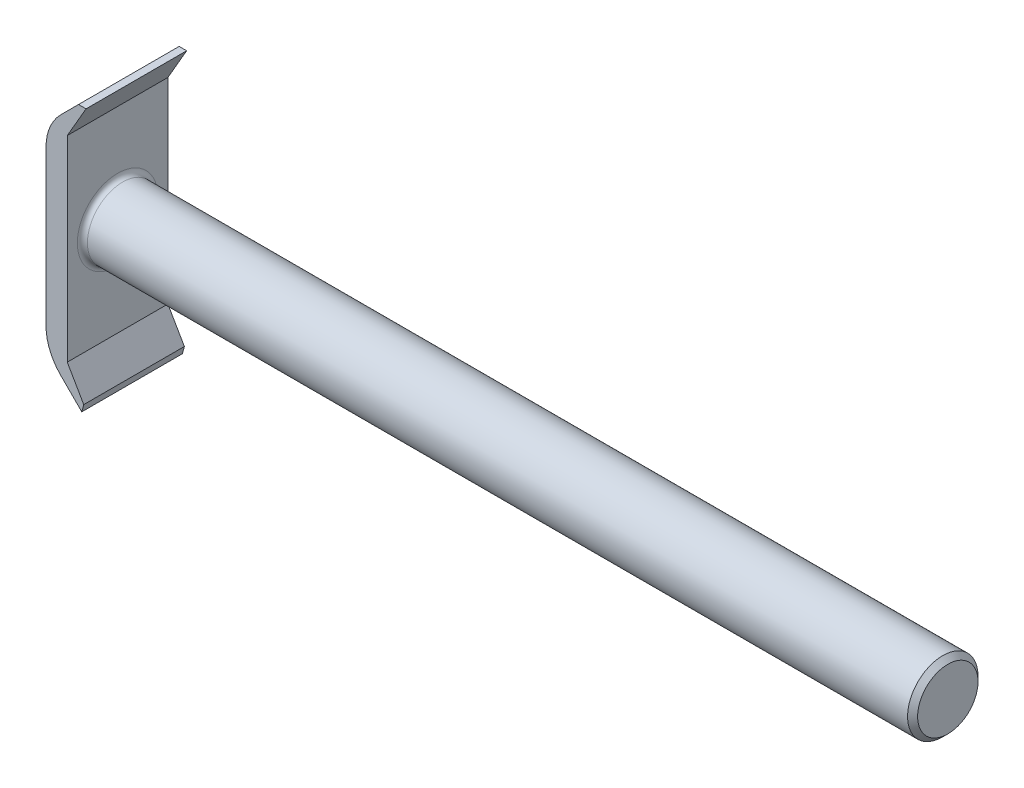
ISO-10303-21;
HEADER;
FILE_DESCRIPTION(('STEP AP214'),'2;1');
FILE_NAME('part.step','',(''),(''),'','','');
FILE_SCHEMA(('AUTOMOTIVE_DESIGN { 1 0 10303 214 1 1 1 1 }'));
ENDSEC;
DATA;
#1=APPLICATION_CONTEXT('core data for automotive mechanical design processes');
#2=APPLICATION_PROTOCOL_DEFINITION('international standard','automotive_design',2000,#1);
#3=PRODUCT_CONTEXT('',#1,'mechanical');
#4=PRODUCT('Part','Part','',(#3));
#5=PRODUCT_RELATED_PRODUCT_CATEGORY('part','',(#4));
#6=PRODUCT_DEFINITION_FORMATION('','',#4);
#7=PRODUCT_DEFINITION_CONTEXT('part definition',#1,'design');
#8=PRODUCT_DEFINITION('design','',#6,#7);
#9=PRODUCT_DEFINITION_SHAPE('','',#8);
#10=(LENGTH_UNIT() NAMED_UNIT(*) SI_UNIT(.MILLI.,.METRE.));
#11=(NAMED_UNIT(*) PLANE_ANGLE_UNIT() SI_UNIT($,.RADIAN.));
#12=(NAMED_UNIT(*) SI_UNIT($,.STERADIAN.) SOLID_ANGLE_UNIT());
#13=UNCERTAINTY_MEASURE_WITH_UNIT(LENGTH_MEASURE(1.E-05),#10,'distance_accuracy_value','');
#14=(GEOMETRIC_REPRESENTATION_CONTEXT(3) GLOBAL_UNCERTAINTY_ASSIGNED_CONTEXT((#13)) GLOBAL_UNIT_ASSIGNED_CONTEXT((#10,
#11,#12)) REPRESENTATION_CONTEXT('',''));
#15=CARTESIAN_POINT('',(0.,0.,0.));
#16=DIRECTION('',(0.,0.,1.));
#17=DIRECTION('',(1.,0.,0.));
#18=AXIS2_PLACEMENT_3D('',#15,#16,#17);
#19=CARTESIAN_POINT('',(165.,0.,0.));
#20=DIRECTION('',(-1.,0.,0.));
#21=DIRECTION('',(0.,0.,1.));
#22=AXIS2_PLACEMENT_3D('',#19,#20,#21);
#23=CYLINDRICAL_SURFACE('',#22,7.);
#24=CARTESIAN_POINT('',(1.,0.,0.));
#25=DIRECTION('',(1.,0.,0.));
#26=DIRECTION('',(0.,0.,-1.));
#27=AXIS2_PLACEMENT_3D('',#24,#25,#26);
#28=CIRCLE('',#27,7.);
#29=CARTESIAN_POINT('',(1.,0.,-7.));
#30=VERTEX_POINT('',#29);
#31=EDGE_CURVE('E45',#30,#30,#28,.T.);
#32=ORIENTED_EDGE('',*,*,#31,.T.);
#33=EDGE_LOOP('',(#32));
#34=FACE_BOUND('',#33,.T.);
#35=CARTESIAN_POINT('',(164.,0.,0.));
#36=DIRECTION('',(1.,0.,0.));
#37=DIRECTION('',(0.,0.,-1.));
#38=AXIS2_PLACEMENT_3D('',#35,#36,#37);
#39=CIRCLE('',#38,7.);
#40=CARTESIAN_POINT('',(164.,0.,-7.));
#41=VERTEX_POINT('',#40);
#42=EDGE_CURVE('E186',#41,#41,#39,.F.);
#43=ORIENTED_EDGE('',*,*,#42,.T.);
#44=EDGE_LOOP('',(#43));
#45=FACE_BOUND('',#44,.T.);
#46=ADVANCED_FACE('F37',(#34,#45),#23,.T.);
#47=CARTESIAN_POINT('',(165.,0.,0.));
#48=DIRECTION('',(1.,0.,0.));
#49=DIRECTION('',(0.,0.,-1.));
#50=AXIS2_PLACEMENT_3D('',#47,#48,#49);
#51=PLANE('',#50);
#52=CARTESIAN_POINT('',(165.,0.,0.));
#53=DIRECTION('',(1.,0.,0.));
#54=DIRECTION('',(0.,0.,-1.));
#55=AXIS2_PLACEMENT_3D('',#52,#53,#54);
#56=CIRCLE('',#55,6.00000000000003);
#57=CARTESIAN_POINT('',(165.,0.,-6.00000000000003));
#58=VERTEX_POINT('',#57);
#59=EDGE_CURVE('E183',#58,#58,#56,.T.);
#60=ORIENTED_EDGE('',*,*,#59,.T.);
#61=EDGE_LOOP('',(#60));
#62=FACE_BOUND('',#61,.T.);
#63=ADVANCED_FACE('F219',(#62),#51,.T.);
#64=CARTESIAN_POINT('',(5.77350269189627,-29.5,-10.));
#65=DIRECTION('',(0.866025403784438,0.500000000000001,0.));
#66=DIRECTION('',(-0.500000000000001,0.866025403784438,0.));
#67=AXIS2_PLACEMENT_3D('',#64,#65,#66);
#68=PLANE('',#67);
#69=DIRECTION('',(-0.500000000000001,0.866025403784438,0.));
#70=VECTOR('',#69,1.);
#71=CARTESIAN_POINT('',(5.77350269189627,-29.5,10.));
#72=LINE('',#71,#70);
#73=CARTESIAN_POINT('',(3.27350269189632,-25.1698729810779,10.));
#74=VERTEX_POINT('',#73);
#75=CARTESIAN_POINT('',(0.,-19.5,10.));
#76=VERTEX_POINT('',#75);
#77=EDGE_CURVE('E137',#74,#76,#72,.T.);
#78=ORIENTED_EDGE('',*,*,#77,.F.);
#79=DIRECTION('',(0.,0.,-1.));
#80=VECTOR('',#79,1.);
#81=CARTESIAN_POINT('',(3.27350269189632,-25.1698729810779,-10.));
#82=LINE('',#81,#80);
#83=CARTESIAN_POINT('',(3.27350269189632,-25.1698729810779,-10.));
#84=VERTEX_POINT('',#83);
#85=EDGE_CURVE('E173',#74,#84,#82,.T.);
#86=ORIENTED_EDGE('',*,*,#85,.T.);
#87=DIRECTION('',(-0.500000000000001,0.866025403784438,0.));
#88=VECTOR('',#87,1.);
#89=CARTESIAN_POINT('',(5.77350269189627,-29.5,-10.));
#90=LINE('',#89,#88);
#91=CARTESIAN_POINT('',(0.,-19.5,-10.));
#92=VERTEX_POINT('',#91);
#93=EDGE_CURVE('E129',#84,#92,#90,.T.);
#94=ORIENTED_EDGE('',*,*,#93,.T.);
#95=DIRECTION('',(0.,0.,1.));
#96=VECTOR('',#95,1.);
#97=CARTESIAN_POINT('',(0.,-19.5,-10.));
#98=LINE('',#97,#96);
#99=EDGE_CURVE('E128',#92,#76,#98,.T.);
#100=ORIENTED_EDGE('',*,*,#99,.T.);
#101=EDGE_LOOP('',(#78,#86,#94,#100));
#102=FACE_BOUND('',#101,.T.);
#103=ADVANCED_FACE('F224',(#102),#68,.T.);
#104=CARTESIAN_POINT('',(-4.22649730810372,-19.5,-10.));
#105=DIRECTION('',(-0.707106781186547,-0.707106781186548,0.));
#106=DIRECTION('',(0.707106781186548,-0.707106781186547,0.));
#107=AXIS2_PLACEMENT_3D('',#104,#105,#106);
#108=PLANE('',#107);
#109=DIRECTION('',(0.707106781186548,-0.707106781186547,0.));
#110=VECTOR('',#109,1.);
#111=CARTESIAN_POINT('',(-4.22649730810372,-19.5,10.));
#112=LINE('',#111,#110);
#113=CARTESIAN_POINT('',(-1.2975651199692,-22.4289321881345,10.));
#114=VERTEX_POINT('',#113);
#115=CARTESIAN_POINT('',(2.88675134594822,-26.6132486540519,10.));
#116=VERTEX_POINT('',#115);
#117=EDGE_CURVE('E151',#114,#116,#112,.T.);
#118=ORIENTED_EDGE('',*,*,#117,.F.);
#119=DIRECTION('',(0.,0.,1.));
#120=VECTOR('',#119,1.);
#121=CARTESIAN_POINT('',(-1.2975651199692,-22.4289321881345,-10.));
#122=LINE('',#121,#120);
#123=CARTESIAN_POINT('',(-1.2975651199692,-22.4289321881345,-10.));
#124=VERTEX_POINT('',#123);
#125=EDGE_CURVE('E60',#114,#124,#122,.F.);
#126=ORIENTED_EDGE('',*,*,#125,.T.);
#127=DIRECTION('',(0.707106781186548,-0.707106781186547,0.));
#128=VECTOR('',#127,1.);
#129=CARTESIAN_POINT('',(-4.22649730810372,-19.5,-10.));
#130=LINE('',#129,#128);
#131=CARTESIAN_POINT('',(2.88675134594822,-26.6132486540519,-10.));
#132=VERTEX_POINT('',#131);
#133=EDGE_CURVE('E162',#124,#132,#130,.T.);
#134=ORIENTED_EDGE('',*,*,#133,.T.);
#135=DIRECTION('',(0.,0.,1.));
#136=VECTOR('',#135,1.);
#137=CARTESIAN_POINT('',(2.88675134594822,-26.6132486540519,-10.));
#138=LINE('',#137,#136);
#139=EDGE_CURVE('E165',#132,#116,#138,.T.);
#140=ORIENTED_EDGE('',*,*,#139,.T.);
#141=EDGE_LOOP('',(#118,#126,#134,#140));
#142=FACE_BOUND('',#141,.T.);
#143=ADVANCED_FACE('F264',(#142),#108,.T.);
#144=CARTESIAN_POINT('',(-4.22649730810372,19.5,-10.));
#145=DIRECTION('',(-1.,0.,0.));
#146=DIRECTION('',(0.,-1.,0.));
#147=AXIS2_PLACEMENT_3D('',#144,#145,#146);
#148=PLANE('',#147);
#149=DIRECTION('',(0.,-1.,0.));
#150=VECTOR('',#149,1.);
#151=CARTESIAN_POINT('',(-4.22649730810372,19.5,-10.));
#152=LINE('',#151,#150);
#153=CARTESIAN_POINT('',(-4.22649730810372,15.357864376269,-10.));
#154=VERTEX_POINT('',#153);
#155=CARTESIAN_POINT('',(-4.22649730810372,-15.357864376269,-10.));
#156=VERTEX_POINT('',#155);
#157=EDGE_CURVE('E159',#154,#156,#152,.T.);
#158=ORIENTED_EDGE('',*,*,#157,.T.);
#159=DIRECTION('',(0.,0.,1.));
#160=VECTOR('',#159,1.);
#161=CARTESIAN_POINT('',(-4.22649730810372,-15.357864376269,-10.));
#162=LINE('',#161,#160);
#163=CARTESIAN_POINT('',(-4.22649730810372,-15.357864376269,10.));
#164=VERTEX_POINT('',#163);
#165=EDGE_CURVE('E191',#156,#164,#162,.T.);
#166=ORIENTED_EDGE('',*,*,#165,.T.);
#167=DIRECTION('',(0.,-1.,0.));
#168=VECTOR('',#167,1.);
#169=CARTESIAN_POINT('',(-4.22649730810372,19.5,10.));
#170=LINE('',#169,#168);
#171=CARTESIAN_POINT('',(-4.22649730810372,15.357864376269,10.));
#172=VERTEX_POINT('',#171);
#173=EDGE_CURVE('E147',#172,#164,#170,.T.);
#174=ORIENTED_EDGE('',*,*,#173,.F.);
#175=DIRECTION('',(0.,0.,1.));
#176=VECTOR('',#175,1.);
#177=CARTESIAN_POINT('',(-4.22649730810372,15.357864376269,-10.));
#178=LINE('',#177,#176);
#179=EDGE_CURVE('E189',#172,#154,#178,.F.);
#180=ORIENTED_EDGE('',*,*,#179,.T.);
#181=EDGE_LOOP('',(#158,#166,#174,#180));
#182=FACE_BOUND('',#181,.T.);
#183=ADVANCED_FACE('F249',(#182),#148,.T.);
#184=CARTESIAN_POINT('',(5.77350269189627,29.5,-10.));
#185=DIRECTION('',(-0.707106781186548,0.707106781186547,0.));
#186=DIRECTION('',(-0.707106781186547,-0.707106781186548,0.));
#187=AXIS2_PLACEMENT_3D('',#184,#185,#186);
#188=PLANE('',#187);
#189=DIRECTION('',(-0.707106781186547,-0.707106781186548,0.));
#190=VECTOR('',#189,1.);
#191=CARTESIAN_POINT('',(5.77350269189627,29.5,-10.));
#192=LINE('',#191,#190);
#193=CARTESIAN_POINT('',(2.23796878596356,25.9644660940673,-10.));
#194=VERTEX_POINT('',#193);
#195=CARTESIAN_POINT('',(-1.2975651199692,22.4289321881345,-10.));
#196=VERTEX_POINT('',#195);
#197=EDGE_CURVE('E157',#194,#196,#192,.T.);
#198=ORIENTED_EDGE('',*,*,#197,.T.);
#199=DIRECTION('',(0.,0.,1.));
#200=VECTOR('',#199,1.);
#201=CARTESIAN_POINT('',(-1.2975651199692,22.4289321881345,-10.));
#202=LINE('',#201,#200);
#203=CARTESIAN_POINT('',(-1.2975651199692,22.4289321881345,10.));
#204=VERTEX_POINT('',#203);
#205=EDGE_CURVE('E202',#196,#204,#202,.T.);
#206=ORIENTED_EDGE('',*,*,#205,.T.);
#207=DIRECTION('',(-0.707106781186547,-0.707106781186548,0.));
#208=VECTOR('',#207,1.);
#209=CARTESIAN_POINT('',(5.77350269189627,29.5,10.));
#210=LINE('',#209,#208);
#211=CARTESIAN_POINT('',(2.23796878596356,25.9644660940673,10.));
#212=VERTEX_POINT('',#211);
#213=EDGE_CURVE('E144',#212,#204,#210,.T.);
#214=ORIENTED_EDGE('',*,*,#213,.F.);
#215=DIRECTION('',(0.,0.,-1.));
#216=VECTOR('',#215,1.);
#217=CARTESIAN_POINT('',(2.23796878596356,25.9644660940673,-10.));
#218=LINE('',#217,#216);
#219=EDGE_CURVE('E181',#212,#194,#218,.T.);
#220=ORIENTED_EDGE('',*,*,#219,.T.);
#221=EDGE_LOOP('',(#198,#206,#214,#220));
#222=FACE_BOUND('',#221,.T.);
#223=ADVANCED_FACE('F255',(#222),#188,.T.);
#224=CARTESIAN_POINT('',(0.,19.5,-10.));
#225=DIRECTION('',(0.866025403784438,-0.500000000000001,0.));
#226=DIRECTION('',(0.500000000000001,0.866025403784438,0.));
#227=AXIS2_PLACEMENT_3D('',#224,#225,#226);
#228=PLANE('',#227);
#229=DIRECTION('',(0.500000000000001,0.866025403784438,0.));
#230=VECTOR('',#229,1.);
#231=CARTESIAN_POINT('',(0.,19.5,-10.));
#232=LINE('',#231,#230);
#233=CARTESIAN_POINT('',(0.,19.5,-10.));
#234=VERTEX_POINT('',#233);
#235=CARTESIAN_POINT('',(3.73226123957697,25.9644660940673,-10.));
#236=VERTEX_POINT('',#235);
#237=EDGE_CURVE('E155',#234,#236,#232,.T.);
#238=ORIENTED_EDGE('',*,*,#237,.T.);
#239=DIRECTION('',(0.,0.,1.));
#240=VECTOR('',#239,1.);
#241=CARTESIAN_POINT('',(3.73226123957697,25.9644660940673,-10.));
#242=LINE('',#241,#240);
#243=CARTESIAN_POINT('',(3.73226123957697,25.9644660940673,10.));
#244=VERTEX_POINT('',#243);
#245=EDGE_CURVE('E143',#236,#244,#242,.T.);
#246=ORIENTED_EDGE('',*,*,#245,.T.);
#247=DIRECTION('',(0.500000000000001,0.866025403784438,0.));
#248=VECTOR('',#247,1.);
#249=CARTESIAN_POINT('',(0.,19.5,10.));
#250=LINE('',#249,#248);
#251=CARTESIAN_POINT('',(0.,19.5,10.));
#252=VERTEX_POINT('',#251);
#253=EDGE_CURVE('E135',#252,#244,#250,.T.);
#254=ORIENTED_EDGE('',*,*,#253,.F.);
#255=DIRECTION('',(0.,0.,1.));
#256=VECTOR('',#255,1.);
#257=CARTESIAN_POINT('',(0.,19.5,-10.));
#258=LINE('',#257,#256);
#259=EDGE_CURVE('E117',#234,#252,#258,.T.);
#260=ORIENTED_EDGE('',*,*,#259,.F.);
#261=EDGE_LOOP('',(#238,#246,#254,#260));
#262=FACE_BOUND('',#261,.T.);
#263=ADVANCED_FACE('F141',(#262),#228,.T.);
#264=CARTESIAN_POINT('',(0.,0.,-10.));
#265=DIRECTION('',(1.,0.,0.));
#266=DIRECTION('',(0.,0.,-1.));
#267=AXIS2_PLACEMENT_3D('',#264,#265,#266);
#268=PLANE('',#267);
#269=CARTESIAN_POINT('',(0.,0.,0.));
#270=DIRECTION('',(1.,0.,0.));
#271=DIRECTION('',(0.,0.,-1.));
#272=AXIS2_PLACEMENT_3D('',#269,#270,#271);
#273=CIRCLE('',#272,8.);
#274=CARTESIAN_POINT('',(0.,0.,-8.));
#275=VERTEX_POINT('',#274);
#276=EDGE_CURVE('E11',#275,#275,#273,.F.);
#277=ORIENTED_EDGE('',*,*,#276,.T.);
#278=EDGE_LOOP('',(#277));
#279=FACE_BOUND('',#278,.T.);
#280=ORIENTED_EDGE('',*,*,#259,.T.);
#281=DIRECTION('',(0.,1.,0.));
#282=VECTOR('',#281,1.);
#283=CARTESIAN_POINT('',(0.,-19.5,10.));
#284=LINE('',#283,#282);
#285=EDGE_CURVE('E121',#76,#252,#284,.T.);
#286=ORIENTED_EDGE('',*,*,#285,.F.);
#287=ORIENTED_EDGE('',*,*,#99,.F.);
#288=DIRECTION('',(0.,1.,0.));
#289=VECTOR('',#288,1.);
#290=CARTESIAN_POINT('',(0.,-19.5,-10.));
#291=LINE('',#290,#289);
#292=EDGE_CURVE('E123',#92,#234,#291,.T.);
#293=ORIENTED_EDGE('',*,*,#292,.T.);
#294=EDGE_LOOP('',(#280,#286,#287,#293));
#295=FACE_BOUND('',#294,.T.);
#296=ADVANCED_FACE('F119',(#279,#295),#268,.T.);
#297=CARTESIAN_POINT('',(0.,0.,-10.));
#298=DIRECTION('',(0.,0.,1.));
#299=DIRECTION('',(1.,0.,0.));
#300=AXIS2_PLACEMENT_3D('',#297,#298,#299);
#301=PLANE('',#300);
#302=ORIENTED_EDGE('',*,*,#133,.F.);
#303=CARTESIAN_POINT('',(5.77350269189628,-15.357864376269,-10.));
#304=DIRECTION('',(0.,0.,1.));
#305=DIRECTION('',(1.,0.,0.));
#306=AXIS2_PLACEMENT_3D('',#303,#304,#305);
#307=CIRCLE('',#306,10.);
#308=EDGE_CURVE('E200',#124,#156,#307,.F.);
#309=ORIENTED_EDGE('',*,*,#308,.T.);
#310=ORIENTED_EDGE('',*,*,#157,.F.);
#311=CARTESIAN_POINT('',(5.77350269189628,15.357864376269,-10.));
#312=DIRECTION('',(0.,0.,1.));
#313=DIRECTION('',(1.,0.,0.));
#314=AXIS2_PLACEMENT_3D('',#311,#312,#313);
#315=CIRCLE('',#314,10.);
#316=EDGE_CURVE('E52',#154,#196,#315,.F.);
#317=ORIENTED_EDGE('',*,*,#316,.T.);
#318=ORIENTED_EDGE('',*,*,#197,.F.);
#319=DIRECTION('',(-1.,0.,0.));
#320=VECTOR('',#319,1.);
#321=CARTESIAN_POINT('',(3.73226123957697,25.9644660940673,-10.));
#322=LINE('',#321,#320);
#323=EDGE_CURVE('E175',#194,#236,#322,.F.);
#324=ORIENTED_EDGE('',*,*,#323,.T.);
#325=ORIENTED_EDGE('',*,*,#237,.F.);
#326=ORIENTED_EDGE('',*,*,#292,.F.);
#327=ORIENTED_EDGE('',*,*,#93,.F.);
#328=DIRECTION('',(0.258819045102512,0.965925826289071,0.));
#329=VECTOR('',#328,1.);
#330=CARTESIAN_POINT('',(2.88675134594822,-26.6132486540519,-10.));
#331=LINE('',#330,#329);
#332=EDGE_CURVE('E177',#84,#132,#331,.F.);
#333=ORIENTED_EDGE('',*,*,#332,.T.);
#334=EDGE_LOOP('',(#302,#309,#310,#317,#318,#324,#325,#326,#327,#333));
#335=FACE_BOUND('',#334,.T.);
#336=ADVANCED_FACE('F247',(#335),#301,.F.);
#337=CARTESIAN_POINT('',(0.,0.,10.));
#338=DIRECTION('',(0.,0.,1.));
#339=DIRECTION('',(1.,0.,0.));
#340=AXIS2_PLACEMENT_3D('',#337,#338,#339);
#341=PLANE('',#340);
#342=ORIENTED_EDGE('',*,*,#173,.T.);
#343=CARTESIAN_POINT('',(5.77350269189628,-15.357864376269,10.));
#344=DIRECTION('',(0.,0.,1.));
#345=DIRECTION('',(1.,0.,0.));
#346=AXIS2_PLACEMENT_3D('',#343,#344,#345);
#347=CIRCLE('',#346,10.);
#348=EDGE_CURVE('E196',#164,#114,#347,.T.);
#349=ORIENTED_EDGE('',*,*,#348,.T.);
#350=ORIENTED_EDGE('',*,*,#117,.T.);
#351=DIRECTION('',(-0.258819045102512,-0.965925826289071,0.));
#352=VECTOR('',#351,1.);
#353=CARTESIAN_POINT('',(9.34668783648692,-2.50443745769237,10.));
#354=LINE('',#353,#352);
#355=EDGE_CURVE('E171',#116,#74,#354,.F.);
#356=ORIENTED_EDGE('',*,*,#355,.T.);
#357=ORIENTED_EDGE('',*,*,#77,.T.);
#358=ORIENTED_EDGE('',*,*,#285,.T.);
#359=ORIENTED_EDGE('',*,*,#253,.T.);
#360=DIRECTION('',(1.,0.,0.));
#361=VECTOR('',#360,1.);
#362=CARTESIAN_POINT('',(-1.20568550729588E-13,25.9644660940673,10.));
#363=LINE('',#362,#361);
#364=EDGE_CURVE('E169',#244,#212,#363,.F.);
#365=ORIENTED_EDGE('',*,*,#364,.T.);
#366=ORIENTED_EDGE('',*,*,#213,.T.);
#367=CARTESIAN_POINT('',(5.77350269189628,15.357864376269,10.));
#368=DIRECTION('',(0.,0.,1.));
#369=DIRECTION('',(1.,0.,0.));
#370=AXIS2_PLACEMENT_3D('',#367,#368,#369);
#371=CIRCLE('',#370,10.);
#372=EDGE_CURVE('E194',#204,#172,#371,.T.);
#373=ORIENTED_EDGE('',*,*,#372,.T.);
#374=EDGE_LOOP('',(#342,#349,#350,#356,#357,#358,#359,#365,#366,#373));
#375=FACE_BOUND('',#374,.T.);
#376=ADVANCED_FACE('F134',(#375),#341,.T.);
#377=CARTESIAN_POINT('',(2.88675134594822,-26.6132486540519,-10.));
#378=DIRECTION('',(-0.965925826289071,0.258819045102511,0.));
#379=DIRECTION('',(0.,0.,1.));
#380=AXIS2_PLACEMENT_3D('',#377,#378,#379);
#381=PLANE('',#380);
#382=ORIENTED_EDGE('',*,*,#332,.F.);
#383=ORIENTED_EDGE('',*,*,#85,.F.);
#384=ORIENTED_EDGE('',*,*,#355,.F.);
#385=ORIENTED_EDGE('',*,*,#139,.F.);
#386=EDGE_LOOP('',(#382,#383,#384,#385));
#387=FACE_BOUND('',#386,.T.);
#388=ADVANCED_FACE('F229',(#387),#381,.F.);
#389=CARTESIAN_POINT('',(3.73226123957697,25.9644660940673,-10.));
#390=DIRECTION('',(0.,-1.,0.));
#391=DIRECTION('',(0.,0.,1.));
#392=AXIS2_PLACEMENT_3D('',#389,#390,#391);
#393=PLANE('',#392);
#394=ORIENTED_EDGE('',*,*,#323,.F.);
#395=ORIENTED_EDGE('',*,*,#219,.F.);
#396=ORIENTED_EDGE('',*,*,#364,.F.);
#397=ORIENTED_EDGE('',*,*,#245,.F.);
#398=EDGE_LOOP('',(#394,#395,#396,#397));
#399=FACE_BOUND('',#398,.T.);
#400=ADVANCED_FACE('F232',(#399),#393,.F.);
#401=CARTESIAN_POINT('',(165.,0.,0.));
#402=DIRECTION('',(-1.,0.,0.));
#403=DIRECTION('',(0.,0.,1.));
#404=AXIS2_PLACEMENT_3D('',#401,#402,#403);
#405=CONICAL_SURFACE('',#404,6.00000000000003,0.785398163397432);
#406=ORIENTED_EDGE('',*,*,#42,.F.);
#407=EDGE_LOOP('',(#406));
#408=FACE_BOUND('',#407,.T.);
#409=ORIENTED_EDGE('',*,*,#59,.F.);
#410=EDGE_LOOP('',(#409));
#411=FACE_BOUND('',#410,.T.);
#412=ADVANCED_FACE('F236',(#408,#411),#405,.T.);
#413=CARTESIAN_POINT('',(5.77350269189628,-15.357864376269,-10.));
#414=DIRECTION('',(0.,0.,1.));
#415=DIRECTION('',(1.,0.,0.));
#416=AXIS2_PLACEMENT_3D('',#413,#414,#415);
#417=CYLINDRICAL_SURFACE('',#416,10.);
#418=ORIENTED_EDGE('',*,*,#308,.F.);
#419=ORIENTED_EDGE('',*,*,#125,.F.);
#420=ORIENTED_EDGE('',*,*,#348,.F.);
#421=ORIENTED_EDGE('',*,*,#165,.F.);
#422=EDGE_LOOP('',(#418,#419,#420,#421));
#423=FACE_BOUND('',#422,.T.);
#424=ADVANCED_FACE('F215',(#423),#417,.T.);
#425=CARTESIAN_POINT('',(5.77350269189628,15.357864376269,-10.));
#426=DIRECTION('',(0.,0.,1.));
#427=DIRECTION('',(1.,0.,0.));
#428=AXIS2_PLACEMENT_3D('',#425,#426,#427);
#429=CYLINDRICAL_SURFACE('',#428,10.);
#430=ORIENTED_EDGE('',*,*,#316,.F.);
#431=ORIENTED_EDGE('',*,*,#179,.F.);
#432=ORIENTED_EDGE('',*,*,#372,.F.);
#433=ORIENTED_EDGE('',*,*,#205,.F.);
#434=EDGE_LOOP('',(#430,#431,#432,#433));
#435=FACE_BOUND('',#434,.T.);
#436=ADVANCED_FACE('F210',(#435),#429,.T.);
#437=CARTESIAN_POINT('',(1.,0.,0.));
#438=DIRECTION('',(1.,0.,0.));
#439=DIRECTION('',(0.,0.,-1.));
#440=AXIS2_PLACEMENT_3D('',#437,#438,#439);
#441=TOROIDAL_SURFACE('',#440,8.,1.);
#442=ORIENTED_EDGE('',*,*,#276,.F.);
#443=EDGE_LOOP('',(#442));
#444=FACE_BOUND('',#443,.T.);
#445=ORIENTED_EDGE('',*,*,#31,.F.);
#446=EDGE_LOOP('',(#445));
#447=FACE_BOUND('',#446,.T.);
#448=ADVANCED_FACE('F39',(#444,#447),#441,.F.);
#449=CLOSED_SHELL('',(#46,#63,#103,#143,#183,#223,#263,#296,#336,#376,#388,#400,#412,#424,#436,#448));
#450=MANIFOLD_SOLID_BREP('B2',#449);
#451=ADVANCED_BREP_SHAPE_REPRESENTATION('',(#18,#450),#14);
#452=SHAPE_DEFINITION_REPRESENTATION(#9,#451);
ENDSEC;
END-ISO-10303-21;
